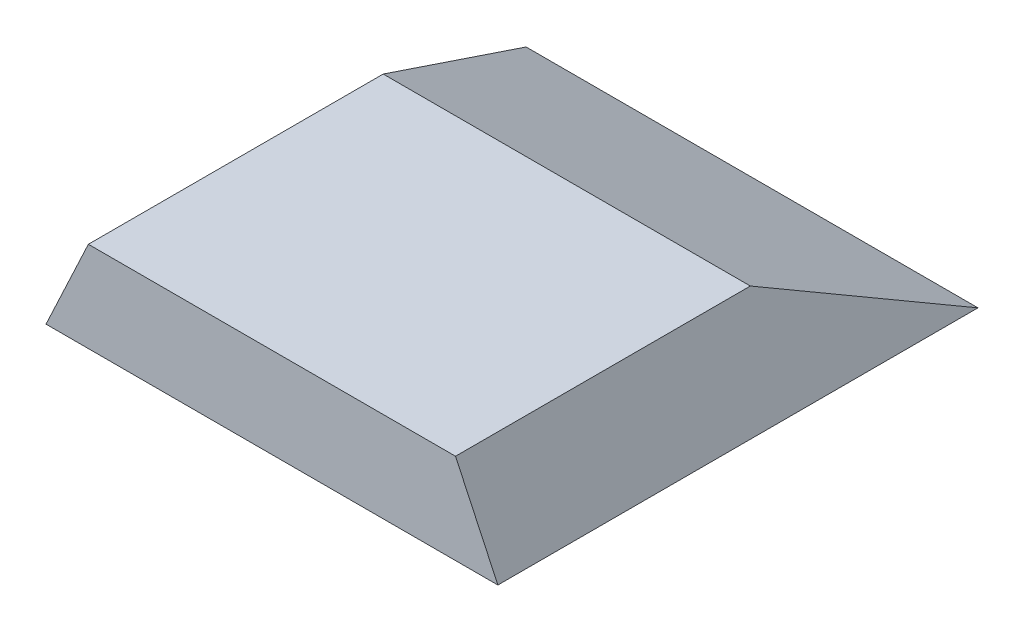
ISO-10303-21;
HEADER;
FILE_DESCRIPTION(('STEP AP214'),'2;1');
FILE_NAME('part.step','',(''),(''),'','','');
FILE_SCHEMA(('AUTOMOTIVE_DESIGN { 1 0 10303 214 1 1 1 1 }'));
ENDSEC;
DATA;
#1=APPLICATION_CONTEXT('core data for automotive mechanical design processes');
#2=APPLICATION_PROTOCOL_DEFINITION('international standard','automotive_design',2000,#1);
#3=PRODUCT_CONTEXT('',#1,'mechanical');
#4=PRODUCT('Part','Part','',(#3));
#5=PRODUCT_RELATED_PRODUCT_CATEGORY('part','',(#4));
#6=PRODUCT_DEFINITION_FORMATION('','',#4);
#7=PRODUCT_DEFINITION_CONTEXT('part definition',#1,'design');
#8=PRODUCT_DEFINITION('design','',#6,#7);
#9=PRODUCT_DEFINITION_SHAPE('','',#8);
#10=(LENGTH_UNIT() NAMED_UNIT(*) SI_UNIT(.MILLI.,.METRE.));
#11=(NAMED_UNIT(*) PLANE_ANGLE_UNIT() SI_UNIT($,.RADIAN.));
#12=(NAMED_UNIT(*) SI_UNIT($,.STERADIAN.) SOLID_ANGLE_UNIT());
#13=UNCERTAINTY_MEASURE_WITH_UNIT(LENGTH_MEASURE(1.E-05),#10,'distance_accuracy_value','');
#14=(GEOMETRIC_REPRESENTATION_CONTEXT(3) GLOBAL_UNCERTAINTY_ASSIGNED_CONTEXT((#13)) GLOBAL_UNIT_ASSIGNED_CONTEXT((#10,
#11,#12)) REPRESENTATION_CONTEXT('',''));
#15=CARTESIAN_POINT('',(0.,0.,0.));
#16=DIRECTION('',(0.,0.,1.));
#17=DIRECTION('',(1.,0.,0.));
#18=AXIS2_PLACEMENT_3D('',#15,#16,#17);
#19=CARTESIAN_POINT('',(6.5,3.2,17.));
#20=DIRECTION('',(0.,-1.,0.));
#21=DIRECTION('',(1.,0.,0.));
#22=AXIS2_PLACEMENT_3D('',#19,#20,#21);
#23=PLANE('',#22);
#24=DIRECTION('',(1.,0.,0.));
#25=VECTOR('',#24,1.);
#26=CARTESIAN_POINT('',(-8.,3.2,6.56097229305385));
#27=LINE('',#26,#25);
#28=CARTESIAN_POINT('',(-6.5,3.2,6.56097229305385));
#29=VERTEX_POINT('',#28);
#30=CARTESIAN_POINT('',(6.5,3.2,6.56097229305385));
#31=VERTEX_POINT('',#30);
#32=EDGE_CURVE('E58',#29,#31,#27,.T.);
#33=ORIENTED_EDGE('',*,*,#32,.F.);
#34=DIRECTION('',(0.,0.,-1.));
#35=VECTOR('',#34,1.);
#36=CARTESIAN_POINT('',(-6.5,3.2,17.));
#37=LINE('',#36,#35);
#38=CARTESIAN_POINT('',(-6.5,3.2,17.));
#39=VERTEX_POINT('',#38);
#40=EDGE_CURVE('E52',#39,#29,#37,.T.);
#41=ORIENTED_EDGE('',*,*,#40,.F.);
#42=DIRECTION('',(-1.,0.,0.));
#43=VECTOR('',#42,1.);
#44=CARTESIAN_POINT('',(6.5,3.2,17.));
#45=LINE('',#44,#43);
#46=CARTESIAN_POINT('',(6.5,3.2,17.));
#47=VERTEX_POINT('',#46);
#48=EDGE_CURVE('E98',#47,#39,#45,.T.);
#49=ORIENTED_EDGE('',*,*,#48,.F.);
#50=DIRECTION('',(0.,0.,-1.));
#51=VECTOR('',#50,1.);
#52=CARTESIAN_POINT('',(6.5,3.2,17.));
#53=LINE('',#52,#51);
#54=EDGE_CURVE('E101',#47,#31,#53,.T.);
#55=ORIENTED_EDGE('',*,*,#54,.T.);
#56=EDGE_LOOP('',(#33,#41,#49,#55));
#57=FACE_BOUND('',#56,.T.);
#58=ADVANCED_FACE('F44',(#57),#23,.F.);
#59=CARTESIAN_POINT('',(-6.5,3.2,17.));
#60=DIRECTION('',(0.905458935958868,-0.42443387623072,0.));
#61=DIRECTION('',(0.42443387623072,0.905458935958868,0.));
#62=AXIS2_PLACEMENT_3D('',#59,#60,#61);
#63=PLANE('',#62);
#64=ORIENTED_EDGE('',*,*,#40,.T.);
#65=DIRECTION('',(-0.201280898923348,-0.429399251036474,-0.880398933971369));
#66=VECTOR('',#65,1.);
#67=CARTESIAN_POINT('',(-4.65012611411134,7.14639762322912,14.6522865003601));
#68=LINE('',#67,#66);
#69=CARTESIAN_POINT('',(-8.,0.,0.));
#70=VERTEX_POINT('',#69);
#71=EDGE_CURVE('E99',#29,#70,#68,.T.);
#72=ORIENTED_EDGE('',*,*,#71,.T.);
#73=DIRECTION('',(0.,0.,-1.));
#74=VECTOR('',#73,1.);
#75=CARTESIAN_POINT('',(-8.,0.,17.));
#76=LINE('',#75,#74);
#77=CARTESIAN_POINT('',(-8.,0.,17.));
#78=VERTEX_POINT('',#77);
#79=EDGE_CURVE('E100',#78,#70,#76,.T.);
#80=ORIENTED_EDGE('',*,*,#79,.F.);
#81=DIRECTION('',(-0.42443387623072,-0.905458935958868,0.));
#82=VECTOR('',#81,1.);
#83=CARTESIAN_POINT('',(-6.5,3.2,17.));
#84=LINE('',#83,#82);
#85=EDGE_CURVE('E113',#39,#78,#84,.T.);
#86=ORIENTED_EDGE('',*,*,#85,.F.);
#87=EDGE_LOOP('',(#64,#72,#80,#86));
#88=FACE_BOUND('',#87,.T.);
#89=ADVANCED_FACE('F114',(#88),#63,.F.);
#90=CARTESIAN_POINT('',(-8.,0.,17.));
#91=DIRECTION('',(0.,1.,0.));
#92=DIRECTION('',(-1.,0.,0.));
#93=AXIS2_PLACEMENT_3D('',#90,#91,#92);
#94=PLANE('',#93);
#95=DIRECTION('',(1.,0.,0.));
#96=VECTOR('',#95,1.);
#97=CARTESIAN_POINT('',(-8.,0.,0.));
#98=LINE('',#97,#96);
#99=CARTESIAN_POINT('',(8.,0.,0.));
#100=VERTEX_POINT('',#99);
#101=EDGE_CURVE('E82',#70,#100,#98,.T.);
#102=ORIENTED_EDGE('',*,*,#101,.T.);
#103=DIRECTION('',(0.,0.,-1.));
#104=VECTOR('',#103,1.);
#105=CARTESIAN_POINT('',(8.,0.,17.));
#106=LINE('',#105,#104);
#107=CARTESIAN_POINT('',(8.,0.,17.));
#108=VERTEX_POINT('',#107);
#109=EDGE_CURVE('E94',#108,#100,#106,.T.);
#110=ORIENTED_EDGE('',*,*,#109,.F.);
#111=DIRECTION('',(1.,0.,0.));
#112=VECTOR('',#111,1.);
#113=CARTESIAN_POINT('',(-8.,0.,17.));
#114=LINE('',#113,#112);
#115=EDGE_CURVE('E130',#78,#108,#114,.T.);
#116=ORIENTED_EDGE('',*,*,#115,.F.);
#117=ORIENTED_EDGE('',*,*,#79,.T.);
#118=EDGE_LOOP('',(#102,#110,#116,#117));
#119=FACE_BOUND('',#118,.T.);
#120=ADVANCED_FACE('F93',(#119),#94,.F.);
#121=CARTESIAN_POINT('',(8.,0.,17.));
#122=DIRECTION('',(-0.905458935958868,-0.42443387623072,0.));
#123=DIRECTION('',(0.42443387623072,-0.905458935958868,0.));
#124=AXIS2_PLACEMENT_3D('',#121,#122,#123);
#125=PLANE('',#124);
#126=ORIENTED_EDGE('',*,*,#109,.T.);
#127=DIRECTION('',(-0.201280898923347,0.429399251036474,0.88039893397137));
#128=VECTOR('',#127,1.);
#129=CARTESIAN_POINT('',(4.98747268970446,6.42672492863048,13.1767388099447));
#130=LINE('',#129,#128);
#131=EDGE_CURVE('E11',#100,#31,#130,.T.);
#132=ORIENTED_EDGE('',*,*,#131,.T.);
#133=ORIENTED_EDGE('',*,*,#54,.F.);
#134=DIRECTION('',(-0.42443387623072,0.905458935958868,0.));
#135=VECTOR('',#134,1.);
#136=CARTESIAN_POINT('',(8.,0.,17.));
#137=LINE('',#136,#135);
#138=EDGE_CURVE('E70',#108,#47,#137,.T.);
#139=ORIENTED_EDGE('',*,*,#138,.F.);
#140=EDGE_LOOP('',(#126,#132,#133,#139));
#141=FACE_BOUND('',#140,.T.);
#142=ADVANCED_FACE('F105',(#141),#125,.F.);
#143=CARTESIAN_POINT('',(0.,0.,17.));
#144=DIRECTION('',(0.,0.,1.));
#145=DIRECTION('',(1.,0.,0.));
#146=AXIS2_PLACEMENT_3D('',#143,#144,#145);
#147=PLANE('',#146);
#148=ORIENTED_EDGE('',*,*,#48,.T.);
#149=ORIENTED_EDGE('',*,*,#85,.T.);
#150=ORIENTED_EDGE('',*,*,#115,.T.);
#151=ORIENTED_EDGE('',*,*,#138,.T.);
#152=EDGE_LOOP('',(#148,#149,#150,#151));
#153=FACE_BOUND('',#152,.T.);
#154=ADVANCED_FACE('F131',(#153),#147,.T.);
#155=CARTESIAN_POINT('',(-8.,0.,0.));
#156=DIRECTION('',(0.,-0.89879404629917,0.438371146789072));
#157=DIRECTION('',(0.,-0.438371146789072,-0.89879404629917));
#158=AXIS2_PLACEMENT_3D('',#155,#156,#157);
#159=PLANE('',#158);
#160=ORIENTED_EDGE('',*,*,#32,.T.);
#161=ORIENTED_EDGE('',*,*,#131,.F.);
#162=ORIENTED_EDGE('',*,*,#101,.F.);
#163=ORIENTED_EDGE('',*,*,#71,.F.);
#164=EDGE_LOOP('',(#160,#161,#162,#163));
#165=FACE_BOUND('',#164,.T.);
#166=ADVANCED_FACE('F84',(#165),#159,.F.);
#167=CLOSED_SHELL('',(#58,#89,#120,#142,#154,#166));
#168=MANIFOLD_SOLID_BREP('B2',#167);
#169=ADVANCED_BREP_SHAPE_REPRESENTATION('',(#18,#168),#14);
#170=SHAPE_DEFINITION_REPRESENTATION(#9,#169);
ENDSEC;
END-ISO-10303-21;
